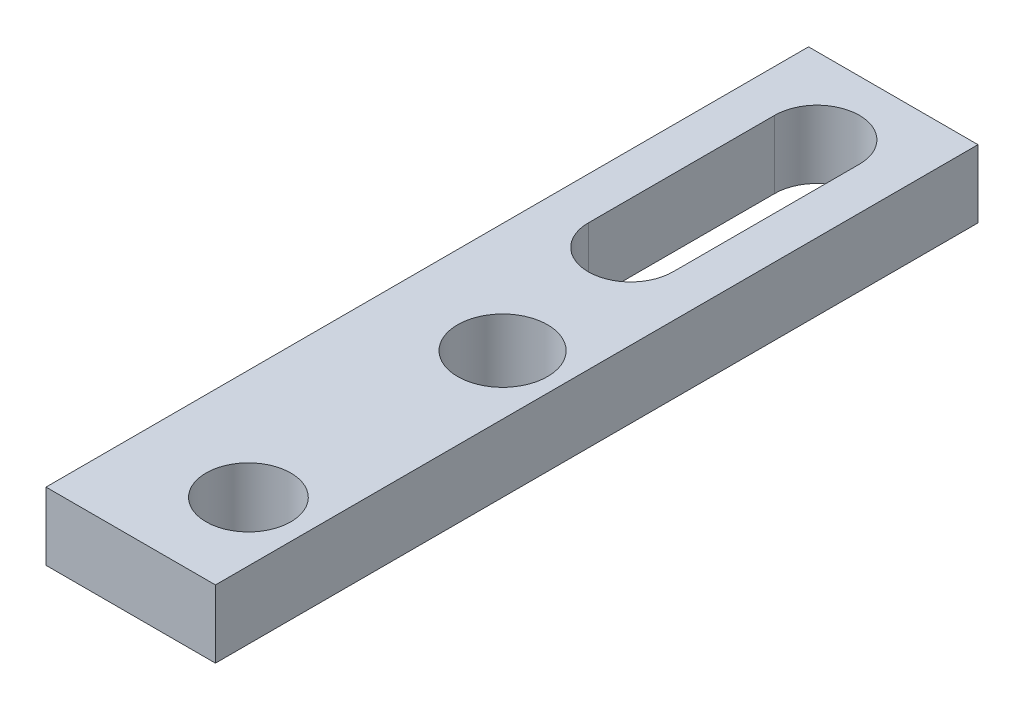
ISO-10303-21;
HEADER;
FILE_DESCRIPTION(('STEP AP214'),'2;1');
FILE_NAME('part.step','',(''),(''),'','','');
FILE_SCHEMA(('AUTOMOTIVE_DESIGN { 1 0 10303 214 1 1 1 1 }'));
ENDSEC;
DATA;
#1=APPLICATION_CONTEXT('core data for automotive mechanical design processes');
#2=APPLICATION_PROTOCOL_DEFINITION('international standard','automotive_design',2000,#1);
#3=PRODUCT_CONTEXT('',#1,'mechanical');
#4=PRODUCT('Part','Part','',(#3));
#5=PRODUCT_RELATED_PRODUCT_CATEGORY('part','',(#4));
#6=PRODUCT_DEFINITION_FORMATION('','',#4);
#7=PRODUCT_DEFINITION_CONTEXT('part definition',#1,'design');
#8=PRODUCT_DEFINITION('design','',#6,#7);
#9=PRODUCT_DEFINITION_SHAPE('','',#8);
#10=(LENGTH_UNIT() NAMED_UNIT(*) SI_UNIT(.MILLI.,.METRE.));
#11=(NAMED_UNIT(*) PLANE_ANGLE_UNIT() SI_UNIT($,.RADIAN.));
#12=(NAMED_UNIT(*) SI_UNIT($,.STERADIAN.) SOLID_ANGLE_UNIT());
#13=UNCERTAINTY_MEASURE_WITH_UNIT(LENGTH_MEASURE(1.E-05),#10,'distance_accuracy_value','');
#14=(GEOMETRIC_REPRESENTATION_CONTEXT(3) GLOBAL_UNCERTAINTY_ASSIGNED_CONTEXT((#13)) GLOBAL_UNIT_ASSIGNED_CONTEXT((#10,
#11,#12)) REPRESENTATION_CONTEXT('',''));
#15=CARTESIAN_POINT('',(0.,0.,0.));
#16=DIRECTION('',(0.,0.,1.));
#17=DIRECTION('',(1.,0.,0.));
#18=AXIS2_PLACEMENT_3D('',#15,#16,#17);
#19=CARTESIAN_POINT('',(0.,4.,0.));
#20=DIRECTION('',(0.,-1.,0.));
#21=DIRECTION('',(0.,0.,-1.));
#22=AXIS2_PLACEMENT_3D('',#19,#20,#21);
#23=PLANE('',#22);
#24=DIRECTION('',(0.,0.,1.));
#25=VECTOR('',#24,1.);
#26=CARTESIAN_POINT('',(-5.,4.,-22.5));
#27=LINE('',#26,#25);
#28=CARTESIAN_POINT('',(-5.,4.,-22.5));
#29=VERTEX_POINT('',#28);
#30=CARTESIAN_POINT('',(-5.,4.,22.5));
#31=VERTEX_POINT('',#30);
#32=EDGE_CURVE('E137',#29,#31,#27,.T.);
#33=ORIENTED_EDGE('',*,*,#32,.T.);
#34=DIRECTION('',(1.,0.,0.));
#35=VECTOR('',#34,1.);
#36=CARTESIAN_POINT('',(5.,4.,22.5));
#37=LINE('',#36,#35);
#38=CARTESIAN_POINT('',(5.,4.,22.5));
#39=VERTEX_POINT('',#38);
#40=EDGE_CURVE('E140',#31,#39,#37,.T.);
#41=ORIENTED_EDGE('',*,*,#40,.T.);
#42=DIRECTION('',(0.,0.,-1.));
#43=VECTOR('',#42,1.);
#44=CARTESIAN_POINT('',(5.,4.,-22.5));
#45=LINE('',#44,#43);
#46=CARTESIAN_POINT('',(5.,4.,-22.5));
#47=VERTEX_POINT('',#46);
#48=EDGE_CURVE('E143',#39,#47,#45,.T.);
#49=ORIENTED_EDGE('',*,*,#48,.T.);
#50=DIRECTION('',(-1.,0.,0.));
#51=VECTOR('',#50,1.);
#52=CARTESIAN_POINT('',(5.,4.,-22.5));
#53=LINE('',#52,#51);
#54=EDGE_CURVE('E145',#47,#29,#53,.T.);
#55=ORIENTED_EDGE('',*,*,#54,.T.);
#56=EDGE_LOOP('',(#33,#41,#49,#55));
#57=FACE_BOUND('',#56,.T.);
#58=CARTESIAN_POINT('',(0.,4.,-18.));
#59=DIRECTION('',(0.,1.,0.));
#60=DIRECTION('',(0.,0.,1.));
#61=AXIS2_PLACEMENT_3D('',#58,#59,#60);
#62=CIRCLE('',#61,2.5);
#63=CARTESIAN_POINT('',(2.5,4.,-18.));
#64=VERTEX_POINT('',#63);
#65=CARTESIAN_POINT('',(-2.5,4.,-18.));
#66=VERTEX_POINT('',#65);
#67=EDGE_CURVE('E98',#64,#66,#62,.T.);
#68=ORIENTED_EDGE('',*,*,#67,.F.);
#69=DIRECTION('',(0.,0.,-1.));
#70=VECTOR('',#69,1.);
#71=CARTESIAN_POINT('',(2.5,4.,-18.));
#72=LINE('',#71,#70);
#73=CARTESIAN_POINT('',(2.5,4.,-7.));
#74=VERTEX_POINT('',#73);
#75=EDGE_CURVE('E121',#74,#64,#72,.T.);
#76=ORIENTED_EDGE('',*,*,#75,.F.);
#77=CARTESIAN_POINT('',(0.,4.,-7.));
#78=DIRECTION('',(0.,1.,0.));
#79=DIRECTION('',(0.,0.,1.));
#80=AXIS2_PLACEMENT_3D('',#77,#78,#79);
#81=CIRCLE('',#80,2.5);
#82=CARTESIAN_POINT('',(-2.5,4.,-7.));
#83=VERTEX_POINT('',#82);
#84=EDGE_CURVE('E119',#83,#74,#81,.T.);
#85=ORIENTED_EDGE('',*,*,#84,.F.);
#86=DIRECTION('',(0.,0.,1.));
#87=VECTOR('',#86,1.);
#88=CARTESIAN_POINT('',(-2.5,4.,-18.));
#89=LINE('',#88,#87);
#90=EDGE_CURVE('E106',#66,#83,#89,.T.);
#91=ORIENTED_EDGE('',*,*,#90,.F.);
#92=EDGE_LOOP('',(#68,#76,#85,#91));
#93=FACE_BOUND('',#92,.T.);
#94=CARTESIAN_POINT('',(1.5,4.,2.05555555555559));
#95=DIRECTION('',(0.,1.,0.));
#96=DIRECTION('',(0.,0.,1.));
#97=AXIS2_PLACEMENT_3D('',#94,#95,#96);
#98=CIRCLE('',#97,2.65332309694657);
#99=CARTESIAN_POINT('',(1.5,4.,4.70887865250216));
#100=VERTEX_POINT('',#99);
#101=EDGE_CURVE('E127',#100,#100,#98,.T.);
#102=ORIENTED_EDGE('',*,*,#101,.F.);
#103=EDGE_LOOP('',(#102));
#104=FACE_BOUND('',#103,.T.);
#105=CARTESIAN_POINT('',(1.5,4.,17.0555555555556));
#106=DIRECTION('',(0.,1.,0.));
#107=DIRECTION('',(0.,0.,1.));
#108=AXIS2_PLACEMENT_3D('',#105,#106,#107);
#109=CIRCLE('',#108,2.5);
#110=CARTESIAN_POINT('',(1.5,4.,19.5555555555556));
#111=VERTEX_POINT('',#110);
#112=EDGE_CURVE('E226',#111,#111,#109,.T.);
#113=ORIENTED_EDGE('',*,*,#112,.F.);
#114=EDGE_LOOP('',(#113));
#115=FACE_BOUND('',#114,.T.);
#116=ADVANCED_FACE('F33',(#57,#93,#104,#115),#23,.F.);
#117=CARTESIAN_POINT('',(0.,0.,0.));
#118=DIRECTION('',(0.,-1.,0.));
#119=DIRECTION('',(0.,0.,-1.));
#120=AXIS2_PLACEMENT_3D('',#117,#118,#119);
#121=PLANE('',#120);
#122=CARTESIAN_POINT('',(1.5,0.,2.05555555555559));
#123=DIRECTION('',(0.,1.,0.));
#124=DIRECTION('',(0.,0.,1.));
#125=AXIS2_PLACEMENT_3D('',#122,#123,#124);
#126=CIRCLE('',#125,2.65332309694657);
#127=CARTESIAN_POINT('',(1.5,0.,4.70887865250216));
#128=VERTEX_POINT('',#127);
#129=EDGE_CURVE('E232',#128,#128,#126,.T.);
#130=ORIENTED_EDGE('',*,*,#129,.T.);
#131=EDGE_LOOP('',(#130));
#132=FACE_BOUND('',#131,.T.);
#133=DIRECTION('',(0.,0.,1.));
#134=VECTOR('',#133,1.);
#135=CARTESIAN_POINT('',(-5.,0.,-22.5));
#136=LINE('',#135,#134);
#137=CARTESIAN_POINT('',(-5.,0.,-22.5));
#138=VERTEX_POINT('',#137);
#139=CARTESIAN_POINT('',(-5.,0.,22.5));
#140=VERTEX_POINT('',#139);
#141=EDGE_CURVE('E114',#138,#140,#136,.T.);
#142=ORIENTED_EDGE('',*,*,#141,.F.);
#143=DIRECTION('',(-1.,0.,0.));
#144=VECTOR('',#143,1.);
#145=CARTESIAN_POINT('',(5.,0.,-22.5));
#146=LINE('',#145,#144);
#147=CARTESIAN_POINT('',(5.,0.,-22.5));
#148=VERTEX_POINT('',#147);
#149=EDGE_CURVE('E141',#148,#138,#146,.T.);
#150=ORIENTED_EDGE('',*,*,#149,.F.);
#151=DIRECTION('',(0.,0.,-1.));
#152=VECTOR('',#151,1.);
#153=CARTESIAN_POINT('',(5.,0.,-22.5));
#154=LINE('',#153,#152);
#155=CARTESIAN_POINT('',(5.,0.,22.5));
#156=VERTEX_POINT('',#155);
#157=EDGE_CURVE('E152',#156,#148,#154,.T.);
#158=ORIENTED_EDGE('',*,*,#157,.F.);
#159=DIRECTION('',(1.,0.,0.));
#160=VECTOR('',#159,1.);
#161=CARTESIAN_POINT('',(5.,0.,22.5));
#162=LINE('',#161,#160);
#163=EDGE_CURVE('E150',#140,#156,#162,.T.);
#164=ORIENTED_EDGE('',*,*,#163,.F.);
#165=EDGE_LOOP('',(#142,#150,#158,#164));
#166=FACE_BOUND('',#165,.T.);
#167=DIRECTION('',(0.,0.,-1.));
#168=VECTOR('',#167,1.);
#169=CARTESIAN_POINT('',(2.5,0.,-18.));
#170=LINE('',#169,#168);
#171=CARTESIAN_POINT('',(2.5,0.,-7.));
#172=VERTEX_POINT('',#171);
#173=CARTESIAN_POINT('',(2.5,0.,-18.));
#174=VERTEX_POINT('',#173);
#175=EDGE_CURVE('E107',#172,#174,#170,.T.);
#176=ORIENTED_EDGE('',*,*,#175,.T.);
#177=CARTESIAN_POINT('',(0.,0.,-18.));
#178=DIRECTION('',(0.,1.,0.));
#179=DIRECTION('',(0.,0.,1.));
#180=AXIS2_PLACEMENT_3D('',#177,#178,#179);
#181=CIRCLE('',#180,2.5);
#182=CARTESIAN_POINT('',(-2.5,0.,-18.));
#183=VERTEX_POINT('',#182);
#184=EDGE_CURVE('E56',#174,#183,#181,.T.);
#185=ORIENTED_EDGE('',*,*,#184,.T.);
#186=DIRECTION('',(0.,0.,1.));
#187=VECTOR('',#186,1.);
#188=CARTESIAN_POINT('',(-2.5,0.,-18.));
#189=LINE('',#188,#187);
#190=CARTESIAN_POINT('',(-2.5,0.,-7.));
#191=VERTEX_POINT('',#190);
#192=EDGE_CURVE('E113',#183,#191,#189,.T.);
#193=ORIENTED_EDGE('',*,*,#192,.T.);
#194=CARTESIAN_POINT('',(0.,0.,-7.));
#195=DIRECTION('',(0.,1.,0.));
#196=DIRECTION('',(0.,0.,1.));
#197=AXIS2_PLACEMENT_3D('',#194,#195,#196);
#198=CIRCLE('',#197,2.5);
#199=EDGE_CURVE('E129',#191,#172,#198,.T.);
#200=ORIENTED_EDGE('',*,*,#199,.T.);
#201=EDGE_LOOP('',(#176,#185,#193,#200));
#202=FACE_BOUND('',#201,.T.);
#203=CARTESIAN_POINT('',(1.5,0.,17.0555555555556));
#204=DIRECTION('',(0.,1.,0.));
#205=DIRECTION('',(0.,0.,1.));
#206=AXIS2_PLACEMENT_3D('',#203,#204,#205);
#207=CIRCLE('',#206,2.5);
#208=CARTESIAN_POINT('',(1.5,0.,19.5555555555556));
#209=VERTEX_POINT('',#208);
#210=EDGE_CURVE('E229',#209,#209,#207,.T.);
#211=ORIENTED_EDGE('',*,*,#210,.T.);
#212=EDGE_LOOP('',(#211));
#213=FACE_BOUND('',#212,.T.);
#214=ADVANCED_FACE('F170',(#132,#166,#202,#213),#121,.T.);
#215=CARTESIAN_POINT('',(-5.,4.,-22.5));
#216=DIRECTION('',(1.,0.,0.));
#217=DIRECTION('',(0.,0.,-1.));
#218=AXIS2_PLACEMENT_3D('',#215,#216,#217);
#219=PLANE('',#218);
#220=ORIENTED_EDGE('',*,*,#141,.T.);
#221=DIRECTION('',(0.,-1.,0.));
#222=VECTOR('',#221,1.);
#223=CARTESIAN_POINT('',(-5.,4.,22.5));
#224=LINE('',#223,#222);
#225=EDGE_CURVE('E11',#31,#140,#224,.T.);
#226=ORIENTED_EDGE('',*,*,#225,.F.);
#227=ORIENTED_EDGE('',*,*,#32,.F.);
#228=DIRECTION('',(0.,-1.,0.));
#229=VECTOR('',#228,1.);
#230=CARTESIAN_POINT('',(-5.,4.,-22.5));
#231=LINE('',#230,#229);
#232=EDGE_CURVE('E147',#29,#138,#231,.T.);
#233=ORIENTED_EDGE('',*,*,#232,.T.);
#234=EDGE_LOOP('',(#220,#226,#227,#233));
#235=FACE_BOUND('',#234,.T.);
#236=ADVANCED_FACE('F35',(#235),#219,.F.);
#237=CARTESIAN_POINT('',(5.,4.,22.5));
#238=DIRECTION('',(0.,0.,-1.));
#239=DIRECTION('',(-1.,0.,0.));
#240=AXIS2_PLACEMENT_3D('',#237,#238,#239);
#241=PLANE('',#240);
#242=ORIENTED_EDGE('',*,*,#163,.T.);
#243=DIRECTION('',(0.,-1.,0.));
#244=VECTOR('',#243,1.);
#245=CARTESIAN_POINT('',(5.,4.,22.5));
#246=LINE('',#245,#244);
#247=EDGE_CURVE('E41',#39,#156,#246,.T.);
#248=ORIENTED_EDGE('',*,*,#247,.F.);
#249=ORIENTED_EDGE('',*,*,#40,.F.);
#250=ORIENTED_EDGE('',*,*,#225,.T.);
#251=EDGE_LOOP('',(#242,#248,#249,#250));
#252=FACE_BOUND('',#251,.T.);
#253=ADVANCED_FACE('F180',(#252),#241,.F.);
#254=CARTESIAN_POINT('',(5.,4.,-22.5));
#255=DIRECTION('',(-1.,0.,0.));
#256=DIRECTION('',(0.,0.,1.));
#257=AXIS2_PLACEMENT_3D('',#254,#255,#256);
#258=PLANE('',#257);
#259=ORIENTED_EDGE('',*,*,#157,.T.);
#260=DIRECTION('',(0.,-1.,0.));
#261=VECTOR('',#260,1.);
#262=CARTESIAN_POINT('',(5.,4.,-22.5));
#263=LINE('',#262,#261);
#264=EDGE_CURVE('E157',#47,#148,#263,.T.);
#265=ORIENTED_EDGE('',*,*,#264,.F.);
#266=ORIENTED_EDGE('',*,*,#48,.F.);
#267=ORIENTED_EDGE('',*,*,#247,.T.);
#268=EDGE_LOOP('',(#259,#265,#266,#267));
#269=FACE_BOUND('',#268,.T.);
#270=ADVANCED_FACE('F164',(#269),#258,.F.);
#271=CARTESIAN_POINT('',(5.,4.,-22.5));
#272=DIRECTION('',(0.,0.,1.));
#273=DIRECTION('',(1.,0.,0.));
#274=AXIS2_PLACEMENT_3D('',#271,#272,#273);
#275=PLANE('',#274);
#276=ORIENTED_EDGE('',*,*,#149,.T.);
#277=ORIENTED_EDGE('',*,*,#232,.F.);
#278=ORIENTED_EDGE('',*,*,#54,.F.);
#279=ORIENTED_EDGE('',*,*,#264,.T.);
#280=EDGE_LOOP('',(#276,#277,#278,#279));
#281=FACE_BOUND('',#280,.T.);
#282=ADVANCED_FACE('F174',(#281),#275,.F.);
#283=CARTESIAN_POINT('',(0.,4.,-18.));
#284=DIRECTION('',(0.,-1.,0.));
#285=DIRECTION('',(0.,0.,-1.));
#286=AXIS2_PLACEMENT_3D('',#283,#284,#285);
#287=CYLINDRICAL_SURFACE('',#286,2.5);
#288=ORIENTED_EDGE('',*,*,#184,.F.);
#289=DIRECTION('',(0.,-1.,0.));
#290=VECTOR('',#289,1.);
#291=CARTESIAN_POINT('',(2.5,4.,-18.));
#292=LINE('',#291,#290);
#293=EDGE_CURVE('E102',#64,#174,#292,.T.);
#294=ORIENTED_EDGE('',*,*,#293,.F.);
#295=ORIENTED_EDGE('',*,*,#67,.T.);
#296=DIRECTION('',(0.,-1.,0.));
#297=VECTOR('',#296,1.);
#298=CARTESIAN_POINT('',(-2.5,4.,-18.));
#299=LINE('',#298,#297);
#300=EDGE_CURVE('E101',#66,#183,#299,.T.);
#301=ORIENTED_EDGE('',*,*,#300,.T.);
#302=EDGE_LOOP('',(#288,#294,#295,#301));
#303=FACE_BOUND('',#302,.T.);
#304=ADVANCED_FACE('F100',(#303),#287,.F.);
#305=CARTESIAN_POINT('',(-2.5,4.,-18.));
#306=DIRECTION('',(1.,0.,0.));
#307=DIRECTION('',(0.,0.,-1.));
#308=AXIS2_PLACEMENT_3D('',#305,#306,#307);
#309=PLANE('',#308);
#310=ORIENTED_EDGE('',*,*,#192,.F.);
#311=ORIENTED_EDGE('',*,*,#300,.F.);
#312=ORIENTED_EDGE('',*,*,#90,.T.);
#313=DIRECTION('',(0.,-1.,0.));
#314=VECTOR('',#313,1.);
#315=CARTESIAN_POINT('',(-2.5,4.,-7.));
#316=LINE('',#315,#314);
#317=EDGE_CURVE('E115',#83,#191,#316,.T.);
#318=ORIENTED_EDGE('',*,*,#317,.T.);
#319=EDGE_LOOP('',(#310,#311,#312,#318));
#320=FACE_BOUND('',#319,.T.);
#321=ADVANCED_FACE('F110',(#320),#309,.T.);
#322=CARTESIAN_POINT('',(0.,4.,-7.));
#323=DIRECTION('',(0.,-1.,0.));
#324=DIRECTION('',(0.,0.,-1.));
#325=AXIS2_PLACEMENT_3D('',#322,#323,#324);
#326=CYLINDRICAL_SURFACE('',#325,2.5);
#327=ORIENTED_EDGE('',*,*,#199,.F.);
#328=ORIENTED_EDGE('',*,*,#317,.F.);
#329=ORIENTED_EDGE('',*,*,#84,.T.);
#330=DIRECTION('',(0.,-1.,0.));
#331=VECTOR('',#330,1.);
#332=CARTESIAN_POINT('',(2.5,4.,-7.));
#333=LINE('',#332,#331);
#334=EDGE_CURVE('E48',#74,#172,#333,.T.);
#335=ORIENTED_EDGE('',*,*,#334,.T.);
#336=EDGE_LOOP('',(#327,#328,#329,#335));
#337=FACE_BOUND('',#336,.T.);
#338=ADVANCED_FACE('F204',(#337),#326,.F.);
#339=CARTESIAN_POINT('',(2.5,4.,-18.));
#340=DIRECTION('',(-1.,0.,0.));
#341=DIRECTION('',(0.,0.,1.));
#342=AXIS2_PLACEMENT_3D('',#339,#340,#341);
#343=PLANE('',#342);
#344=ORIENTED_EDGE('',*,*,#175,.F.);
#345=ORIENTED_EDGE('',*,*,#334,.F.);
#346=ORIENTED_EDGE('',*,*,#75,.T.);
#347=ORIENTED_EDGE('',*,*,#293,.T.);
#348=EDGE_LOOP('',(#344,#345,#346,#347));
#349=FACE_BOUND('',#348,.T.);
#350=ADVANCED_FACE('F208',(#349),#343,.T.);
#351=CARTESIAN_POINT('',(1.5,4.,2.05555555555559));
#352=DIRECTION('',(0.,-1.,0.));
#353=DIRECTION('',(0.,0.,-1.));
#354=AXIS2_PLACEMENT_3D('',#351,#352,#353);
#355=CYLINDRICAL_SURFACE('',#354,2.65332309694657);
#356=ORIENTED_EDGE('',*,*,#101,.T.);
#357=EDGE_LOOP('',(#356));
#358=FACE_BOUND('',#357,.T.);
#359=ORIENTED_EDGE('',*,*,#129,.F.);
#360=EDGE_LOOP('',(#359));
#361=FACE_BOUND('',#360,.T.);
#362=ADVANCED_FACE('F214',(#358,#361),#355,.F.);
#363=CARTESIAN_POINT('',(1.5,4.,17.0555555555556));
#364=DIRECTION('',(0.,-1.,0.));
#365=DIRECTION('',(0.,0.,-1.));
#366=AXIS2_PLACEMENT_3D('',#363,#364,#365);
#367=CYLINDRICAL_SURFACE('',#366,2.5);
#368=ORIENTED_EDGE('',*,*,#112,.T.);
#369=EDGE_LOOP('',(#368));
#370=FACE_BOUND('',#369,.T.);
#371=ORIENTED_EDGE('',*,*,#210,.F.);
#372=EDGE_LOOP('',(#371));
#373=FACE_BOUND('',#372,.T.);
#374=ADVANCED_FACE('F217',(#370,#373),#367,.F.);
#375=CLOSED_SHELL('',(#116,#214,#236,#253,#270,#282,#304,#321,#338,#350,#362,#374));
#376=MANIFOLD_SOLID_BREP('B2',#375);
#377=ADVANCED_BREP_SHAPE_REPRESENTATION('',(#18,#376),#14);
#378=SHAPE_DEFINITION_REPRESENTATION(#9,#377);
ENDSEC;
END-ISO-10303-21;
